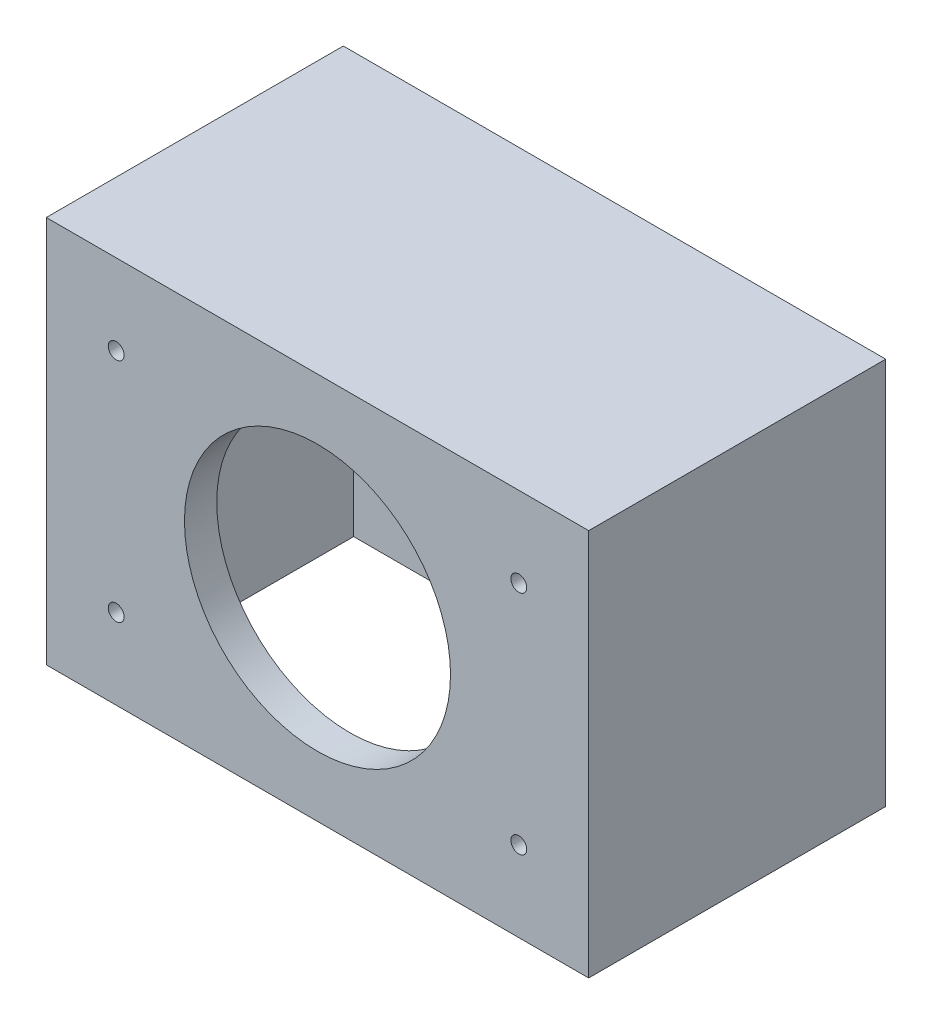
ISO-10303-21;
HEADER;
FILE_DESCRIPTION(('STEP AP214'),'2;1');
FILE_NAME('part.step','',(''),(''),'','','');
FILE_SCHEMA(('AUTOMOTIVE_DESIGN { 1 0 10303 214 1 1 1 1 }'));
ENDSEC;
DATA;
#1=APPLICATION_CONTEXT('core data for automotive mechanical design processes');
#2=APPLICATION_PROTOCOL_DEFINITION('international standard','automotive_design',2000,#1);
#3=PRODUCT_CONTEXT('',#1,'mechanical');
#4=PRODUCT('Part','Part','',(#3));
#5=PRODUCT_RELATED_PRODUCT_CATEGORY('part','',(#4));
#6=PRODUCT_DEFINITION_FORMATION('','',#4);
#7=PRODUCT_DEFINITION_CONTEXT('part definition',#1,'design');
#8=PRODUCT_DEFINITION('design','',#6,#7);
#9=PRODUCT_DEFINITION_SHAPE('','',#8);
#10=(LENGTH_UNIT() NAMED_UNIT(*) SI_UNIT(.MILLI.,.METRE.));
#11=(NAMED_UNIT(*) PLANE_ANGLE_UNIT() SI_UNIT($,.RADIAN.));
#12=(NAMED_UNIT(*) SI_UNIT($,.STERADIAN.) SOLID_ANGLE_UNIT());
#13=UNCERTAINTY_MEASURE_WITH_UNIT(LENGTH_MEASURE(1.E-05),#10,'distance_accuracy_value','');
#14=(GEOMETRIC_REPRESENTATION_CONTEXT(3) GLOBAL_UNCERTAINTY_ASSIGNED_CONTEXT((#13)) GLOBAL_UNIT_ASSIGNED_CONTEXT((#10,
#11,#12)) REPRESENTATION_CONTEXT('',''));
#15=CARTESIAN_POINT('',(0.,0.,0.));
#16=DIRECTION('',(0.,0.,1.));
#17=DIRECTION('',(1.,0.,0.));
#18=AXIS2_PLACEMENT_3D('',#15,#16,#17);
#19=CARTESIAN_POINT('',(105.,-75.,115.));
#20=DIRECTION('',(-1.,0.,0.));
#21=DIRECTION('',(0.,0.,1.));
#22=AXIS2_PLACEMENT_3D('',#19,#20,#21);
#23=PLANE('',#22);
#24=DIRECTION('',(0.,1.,0.));
#25=VECTOR('',#24,1.);
#26=CARTESIAN_POINT('',(105.,-75.,0.));
#27=LINE('',#26,#25);
#28=CARTESIAN_POINT('',(105.,-75.,0.));
#29=VERTEX_POINT('',#28);
#30=CARTESIAN_POINT('',(105.,75.,0.));
#31=VERTEX_POINT('',#30);
#32=EDGE_CURVE('E160',#29,#31,#27,.T.);
#33=ORIENTED_EDGE('',*,*,#32,.T.);
#34=DIRECTION('',(0.,0.,-1.));
#35=VECTOR('',#34,1.);
#36=CARTESIAN_POINT('',(105.,75.,115.));
#37=LINE('',#36,#35);
#38=CARTESIAN_POINT('',(105.,75.,115.));
#39=VERTEX_POINT('',#38);
#40=EDGE_CURVE('E11',#39,#31,#37,.T.);
#41=ORIENTED_EDGE('',*,*,#40,.F.);
#42=DIRECTION('',(0.,1.,0.));
#43=VECTOR('',#42,1.);
#44=CARTESIAN_POINT('',(105.,-75.,115.));
#45=LINE('',#44,#43);
#46=CARTESIAN_POINT('',(105.,-75.,115.));
#47=VERTEX_POINT('',#46);
#48=EDGE_CURVE('E166',#47,#39,#45,.T.);
#49=ORIENTED_EDGE('',*,*,#48,.F.);
#50=DIRECTION('',(0.,0.,-1.));
#51=VECTOR('',#50,1.);
#52=CARTESIAN_POINT('',(105.,-75.,115.));
#53=LINE('',#52,#51);
#54=EDGE_CURVE('E63',#47,#29,#53,.T.);
#55=ORIENTED_EDGE('',*,*,#54,.T.);
#56=EDGE_LOOP('',(#33,#41,#49,#55));
#57=FACE_BOUND('',#56,.T.);
#58=ADVANCED_FACE('F39',(#57),#23,.F.);
#59=CARTESIAN_POINT('',(105.,75.,115.));
#60=DIRECTION('',(0.,-1.,0.));
#61=DIRECTION('',(1.,0.,0.));
#62=AXIS2_PLACEMENT_3D('',#59,#60,#61);
#63=PLANE('',#62);
#64=DIRECTION('',(-1.,0.,0.));
#65=VECTOR('',#64,1.);
#66=CARTESIAN_POINT('',(105.,75.,0.));
#67=LINE('',#66,#65);
#68=CARTESIAN_POINT('',(-105.,75.,0.));
#69=VERTEX_POINT('',#68);
#70=EDGE_CURVE('E181',#31,#69,#67,.T.);
#71=ORIENTED_EDGE('',*,*,#70,.T.);
#72=DIRECTION('',(0.,0.,-1.));
#73=VECTOR('',#72,1.);
#74=CARTESIAN_POINT('',(-105.,75.,115.));
#75=LINE('',#74,#73);
#76=CARTESIAN_POINT('',(-105.,75.,115.));
#77=VERTEX_POINT('',#76);
#78=EDGE_CURVE('E47',#77,#69,#75,.T.);
#79=ORIENTED_EDGE('',*,*,#78,.F.);
#80=DIRECTION('',(-1.,0.,0.));
#81=VECTOR('',#80,1.);
#82=CARTESIAN_POINT('',(105.,75.,115.));
#83=LINE('',#82,#81);
#84=EDGE_CURVE('E89',#39,#77,#83,.T.);
#85=ORIENTED_EDGE('',*,*,#84,.F.);
#86=ORIENTED_EDGE('',*,*,#40,.T.);
#87=EDGE_LOOP('',(#71,#79,#85,#86));
#88=FACE_BOUND('',#87,.T.);
#89=ADVANCED_FACE('F201',(#88),#63,.F.);
#90=CARTESIAN_POINT('',(-105.,-75.,115.));
#91=DIRECTION('',(-1.,0.,0.));
#92=DIRECTION('',(0.,0.,1.));
#93=AXIS2_PLACEMENT_3D('',#90,#91,#92);
#94=PLANE('',#93);
#95=DIRECTION('',(0.,1.,0.));
#96=VECTOR('',#95,1.);
#97=CARTESIAN_POINT('',(-105.,-75.,0.));
#98=LINE('',#97,#96);
#99=CARTESIAN_POINT('',(-105.,-75.,0.));
#100=VERTEX_POINT('',#99);
#101=EDGE_CURVE('E185',#100,#69,#98,.T.);
#102=ORIENTED_EDGE('',*,*,#101,.F.);
#103=DIRECTION('',(0.,0.,-1.));
#104=VECTOR('',#103,1.);
#105=CARTESIAN_POINT('',(-105.,-75.,115.));
#106=LINE('',#105,#104);
#107=CARTESIAN_POINT('',(-105.,-75.,115.));
#108=VERTEX_POINT('',#107);
#109=EDGE_CURVE('E194',#108,#100,#106,.T.);
#110=ORIENTED_EDGE('',*,*,#109,.F.);
#111=DIRECTION('',(0.,1.,0.));
#112=VECTOR('',#111,1.);
#113=CARTESIAN_POINT('',(-105.,-75.,115.));
#114=LINE('',#113,#112);
#115=EDGE_CURVE('E172',#108,#77,#114,.T.);
#116=ORIENTED_EDGE('',*,*,#115,.T.);
#117=ORIENTED_EDGE('',*,*,#78,.T.);
#118=EDGE_LOOP('',(#102,#110,#116,#117));
#119=FACE_BOUND('',#118,.T.);
#120=ADVANCED_FACE('F199',(#119),#94,.T.);
#121=CARTESIAN_POINT('',(105.,-75.,115.));
#122=DIRECTION('',(0.,-1.,0.));
#123=DIRECTION('',(1.,0.,0.));
#124=AXIS2_PLACEMENT_3D('',#121,#122,#123);
#125=PLANE('',#124);
#126=DIRECTION('',(0.,0.,-1.));
#127=VECTOR('',#126,1.);
#128=CARTESIAN_POINT('',(-88.4868315072394,-75.,12.5));
#129=LINE('',#128,#127);
#130=CARTESIAN_POINT('',(-88.4868315072394,-75.,102.5));
#131=VERTEX_POINT('',#130);
#132=CARTESIAN_POINT('',(-88.4868315072394,-75.,12.5));
#133=VERTEX_POINT('',#132);
#134=EDGE_CURVE('E54',#131,#133,#129,.T.);
#135=ORIENTED_EDGE('',*,*,#134,.F.);
#136=DIRECTION('',(-1.,0.,0.));
#137=VECTOR('',#136,1.);
#138=CARTESIAN_POINT('',(88.4868315072394,-75.,102.5));
#139=LINE('',#138,#137);
#140=CARTESIAN_POINT('',(88.4868315072394,-75.,102.5));
#141=VERTEX_POINT('',#140);
#142=EDGE_CURVE('E135',#141,#131,#139,.T.);
#143=ORIENTED_EDGE('',*,*,#142,.F.);
#144=DIRECTION('',(0.,0.,1.));
#145=VECTOR('',#144,1.);
#146=CARTESIAN_POINT('',(88.4868315072394,-75.,12.5));
#147=LINE('',#146,#145);
#148=CARTESIAN_POINT('',(88.4868315072394,-75.,12.5));
#149=VERTEX_POINT('',#148);
#150=EDGE_CURVE('E139',#149,#141,#147,.T.);
#151=ORIENTED_EDGE('',*,*,#150,.F.);
#152=DIRECTION('',(1.,0.,0.));
#153=VECTOR('',#152,1.);
#154=CARTESIAN_POINT('',(88.4868315072394,-75.,12.5));
#155=LINE('',#154,#153);
#156=EDGE_CURVE('E151',#133,#149,#155,.T.);
#157=ORIENTED_EDGE('',*,*,#156,.F.);
#158=EDGE_LOOP('',(#135,#143,#151,#157));
#159=FACE_BOUND('',#158,.T.);
#160=DIRECTION('',(-1.,0.,0.));
#161=VECTOR('',#160,1.);
#162=CARTESIAN_POINT('',(105.,-75.,0.));
#163=LINE('',#162,#161);
#164=EDGE_CURVE('E169',#29,#100,#163,.T.);
#165=ORIENTED_EDGE('',*,*,#164,.F.);
#166=ORIENTED_EDGE('',*,*,#54,.F.);
#167=DIRECTION('',(-1.,0.,0.));
#168=VECTOR('',#167,1.);
#169=CARTESIAN_POINT('',(105.,-75.,115.));
#170=LINE('',#169,#168);
#171=EDGE_CURVE('E176',#47,#108,#170,.T.);
#172=ORIENTED_EDGE('',*,*,#171,.T.);
#173=ORIENTED_EDGE('',*,*,#109,.T.);
#174=EDGE_LOOP('',(#165,#166,#172,#173));
#175=FACE_BOUND('',#174,.T.);
#176=ADVANCED_FACE('F205',(#159,#175),#125,.T.);
#177=CARTESIAN_POINT('',(0.,0.,115.));
#178=DIRECTION('',(0.,0.,1.));
#179=DIRECTION('',(1.,0.,0.));
#180=AXIS2_PLACEMENT_3D('',#177,#178,#179);
#181=PLANE('',#180);
#182=CARTESIAN_POINT('',(0.,0.,115.));
#183=DIRECTION('',(0.,0.,1.));
#184=DIRECTION('',(1.,0.,0.));
#185=AXIS2_PLACEMENT_3D('',#182,#183,#184);
#186=CIRCLE('',#185,51.5);
#187=CARTESIAN_POINT('',(51.5,0.,115.));
#188=VERTEX_POINT('',#187);
#189=EDGE_CURVE('E264',#188,#188,#186,.T.);
#190=ORIENTED_EDGE('',*,*,#189,.F.);
#191=EDGE_LOOP('',(#190));
#192=FACE_BOUND('',#191,.T.);
#193=CARTESIAN_POINT('',(77.9422863405997,-43.87482193696,115.));
#194=DIRECTION('',(0.,0.,1.));
#195=DIRECTION('',(-1.,0.,0.));
#196=AXIS2_PLACEMENT_3D('',#193,#194,#195);
#197=CIRCLE('',#196,3.07250000000001);
#198=CARTESIAN_POINT('',(74.8697863405997,-43.87482193696,115.));
#199=VERTEX_POINT('',#198);
#200=EDGE_CURVE('E269',#199,#199,#197,.T.);
#201=ORIENTED_EDGE('',*,*,#200,.F.);
#202=EDGE_LOOP('',(#201));
#203=FACE_BOUND('',#202,.T.);
#204=CARTESIAN_POINT('',(-77.9422863405997,-43.8748219369601,115.));
#205=DIRECTION('',(0.,0.,1.));
#206=DIRECTION('',(1.,0.,0.));
#207=AXIS2_PLACEMENT_3D('',#204,#205,#206);
#208=CIRCLE('',#207,3.07250000000001);
#209=CARTESIAN_POINT('',(-74.8697863405997,-43.8748219369601,115.));
#210=VERTEX_POINT('',#209);
#211=EDGE_CURVE('E288',#210,#210,#208,.T.);
#212=ORIENTED_EDGE('',*,*,#211,.F.);
#213=EDGE_LOOP('',(#212));
#214=FACE_BOUND('',#213,.T.);
#215=CARTESIAN_POINT('',(-77.9422863405997,43.8748219369601,115.));
#216=DIRECTION('',(0.,0.,1.));
#217=DIRECTION('',(-1.,0.,0.));
#218=AXIS2_PLACEMENT_3D('',#215,#216,#217);
#219=CIRCLE('',#218,3.07250000000001);
#220=CARTESIAN_POINT('',(-81.0147863405997,43.8748219369601,115.));
#221=VERTEX_POINT('',#220);
#222=EDGE_CURVE('E278',#221,#221,#219,.T.);
#223=ORIENTED_EDGE('',*,*,#222,.F.);
#224=EDGE_LOOP('',(#223));
#225=FACE_BOUND('',#224,.T.);
#226=CARTESIAN_POINT('',(77.9422863405997,43.8748219369601,115.));
#227=DIRECTION('',(0.,0.,1.));
#228=DIRECTION('',(1.,0.,0.));
#229=AXIS2_PLACEMENT_3D('',#226,#227,#228);
#230=CIRCLE('',#229,3.07250000000001);
#231=CARTESIAN_POINT('',(81.0147863405997,43.8748219369601,115.));
#232=VERTEX_POINT('',#231);
#233=EDGE_CURVE('E287',#232,#232,#230,.T.);
#234=ORIENTED_EDGE('',*,*,#233,.F.);
#235=EDGE_LOOP('',(#234));
#236=FACE_BOUND('',#235,.T.);
#237=ORIENTED_EDGE('',*,*,#48,.T.);
#238=ORIENTED_EDGE('',*,*,#84,.T.);
#239=ORIENTED_EDGE('',*,*,#115,.F.);
#240=ORIENTED_EDGE('',*,*,#171,.F.);
#241=EDGE_LOOP('',(#237,#238,#239,#240));
#242=FACE_BOUND('',#241,.T.);
#243=ADVANCED_FACE('F208',(#192,#203,#214,#225,#236,#242),#181,.T.);
#244=CARTESIAN_POINT('',(0.,0.,0.));
#245=DIRECTION('',(0.,0.,1.));
#246=DIRECTION('',(1.,0.,0.));
#247=AXIS2_PLACEMENT_3D('',#244,#245,#246);
#248=PLANE('',#247);
#249=ORIENTED_EDGE('',*,*,#32,.F.);
#250=ORIENTED_EDGE('',*,*,#164,.T.);
#251=ORIENTED_EDGE('',*,*,#101,.T.);
#252=ORIENTED_EDGE('',*,*,#70,.F.);
#253=EDGE_LOOP('',(#249,#250,#251,#252));
#254=FACE_BOUND('',#253,.T.);
#255=ADVANCED_FACE('F204',(#254),#248,.F.);
#256=CARTESIAN_POINT('',(-88.4868315072394,54.,12.5));
#257=DIRECTION('',(-1.,0.,0.));
#258=DIRECTION('',(0.,-1.,0.));
#259=AXIS2_PLACEMENT_3D('',#256,#257,#258);
#260=PLANE('',#259);
#261=ORIENTED_EDGE('',*,*,#134,.T.);
#262=DIRECTION('',(0.,-1.,0.));
#263=VECTOR('',#262,1.);
#264=CARTESIAN_POINT('',(-88.4868315072394,54.,12.5));
#265=LINE('',#264,#263);
#266=CARTESIAN_POINT('',(-88.4868315072394,54.,12.5));
#267=VERTEX_POINT('',#266);
#268=EDGE_CURVE('E110',#267,#133,#265,.T.);
#269=ORIENTED_EDGE('',*,*,#268,.F.);
#270=DIRECTION('',(0.,0.,-1.));
#271=VECTOR('',#270,1.);
#272=CARTESIAN_POINT('',(-88.4868315072394,54.,12.5));
#273=LINE('',#272,#271);
#274=CARTESIAN_POINT('',(-88.4868315072394,54.,102.5));
#275=VERTEX_POINT('',#274);
#276=EDGE_CURVE('E114',#275,#267,#273,.T.);
#277=ORIENTED_EDGE('',*,*,#276,.F.);
#278=DIRECTION('',(0.,-1.,0.));
#279=VECTOR('',#278,1.);
#280=CARTESIAN_POINT('',(-88.4868315072394,54.,102.5));
#281=LINE('',#280,#279);
#282=EDGE_CURVE('E157',#275,#131,#281,.T.);
#283=ORIENTED_EDGE('',*,*,#282,.T.);
#284=EDGE_LOOP('',(#261,#269,#277,#283));
#285=FACE_BOUND('',#284,.T.);
#286=ADVANCED_FACE('F112',(#285),#260,.F.);
#287=CARTESIAN_POINT('',(88.4868315072394,54.0000000000001,102.5));
#288=DIRECTION('',(0.,0.,1.));
#289=DIRECTION('',(1.,0.,0.));
#290=AXIS2_PLACEMENT_3D('',#287,#288,#289);
#291=PLANE('',#290);
#292=CARTESIAN_POINT('',(0.,0.,102.5));
#293=DIRECTION('',(0.,0.,1.));
#294=DIRECTION('',(1.,0.,0.));
#295=AXIS2_PLACEMENT_3D('',#292,#293,#294);
#296=CIRCLE('',#295,51.5);
#297=CARTESIAN_POINT('',(51.5,0.,102.5));
#298=VERTEX_POINT('',#297);
#299=EDGE_CURVE('E267',#298,#298,#296,.F.);
#300=ORIENTED_EDGE('',*,*,#299,.F.);
#301=EDGE_LOOP('',(#300));
#302=FACE_BOUND('',#301,.T.);
#303=CARTESIAN_POINT('',(77.9422863405997,-43.87482193696,102.5));
#304=DIRECTION('',(0.,0.,1.));
#305=DIRECTION('',(1.,0.,0.));
#306=AXIS2_PLACEMENT_3D('',#303,#304,#305);
#307=CIRCLE('',#306,3.07250000000001);
#308=CARTESIAN_POINT('',(81.0147863405997,-43.87482193696,102.5));
#309=VERTEX_POINT('',#308);
#310=EDGE_CURVE('E274',#309,#309,#307,.F.);
#311=ORIENTED_EDGE('',*,*,#310,.F.);
#312=EDGE_LOOP('',(#311));
#313=FACE_BOUND('',#312,.T.);
#314=CARTESIAN_POINT('',(-77.9422863405997,-43.8748219369601,102.5));
#315=DIRECTION('',(0.,0.,1.));
#316=DIRECTION('',(1.,0.,0.));
#317=AXIS2_PLACEMENT_3D('',#314,#315,#316);
#318=CIRCLE('',#317,3.07250000000001);
#319=CARTESIAN_POINT('',(-74.8697863405997,-43.8748219369601,102.5));
#320=VERTEX_POINT('',#319);
#321=EDGE_CURVE('E283',#320,#320,#318,.F.);
#322=ORIENTED_EDGE('',*,*,#321,.F.);
#323=EDGE_LOOP('',(#322));
#324=FACE_BOUND('',#323,.T.);
#325=CARTESIAN_POINT('',(-77.9422863405997,43.8748219369601,102.5));
#326=DIRECTION('',(0.,0.,1.));
#327=DIRECTION('',(1.,0.,0.));
#328=AXIS2_PLACEMENT_3D('',#325,#326,#327);
#329=CIRCLE('',#328,3.07250000000001);
#330=CARTESIAN_POINT('',(-74.8697863405997,43.8748219369601,102.5));
#331=VERTEX_POINT('',#330);
#332=EDGE_CURVE('E282',#331,#331,#329,.F.);
#333=ORIENTED_EDGE('',*,*,#332,.F.);
#334=EDGE_LOOP('',(#333));
#335=FACE_BOUND('',#334,.T.);
#336=CARTESIAN_POINT('',(77.9422863405997,43.8748219369601,102.5));
#337=DIRECTION('',(0.,0.,1.));
#338=DIRECTION('',(1.,0.,0.));
#339=AXIS2_PLACEMENT_3D('',#336,#337,#338);
#340=CIRCLE('',#339,3.07250000000001);
#341=CARTESIAN_POINT('',(81.0147863405997,43.8748219369601,102.5));
#342=VERTEX_POINT('',#341);
#343=EDGE_CURVE('E142',#342,#342,#340,.F.);
#344=ORIENTED_EDGE('',*,*,#343,.F.);
#345=EDGE_LOOP('',(#344));
#346=FACE_BOUND('',#345,.T.);
#347=ORIENTED_EDGE('',*,*,#142,.T.);
#348=ORIENTED_EDGE('',*,*,#282,.F.);
#349=DIRECTION('',(-1.,0.,0.));
#350=VECTOR('',#349,1.);
#351=CARTESIAN_POINT('',(88.4868315072394,54.0000000000001,102.5));
#352=LINE('',#351,#350);
#353=CARTESIAN_POINT('',(88.4868315072394,54.0000000000001,102.5));
#354=VERTEX_POINT('',#353);
#355=EDGE_CURVE('E121',#354,#275,#352,.T.);
#356=ORIENTED_EDGE('',*,*,#355,.F.);
#357=DIRECTION('',(0.,-1.,0.));
#358=VECTOR('',#357,1.);
#359=CARTESIAN_POINT('',(88.4868315072394,54.0000000000001,102.5));
#360=LINE('',#359,#358);
#361=EDGE_CURVE('E161',#354,#141,#360,.T.);
#362=ORIENTED_EDGE('',*,*,#361,.T.);
#363=EDGE_LOOP('',(#347,#348,#356,#362));
#364=FACE_BOUND('',#363,.T.);
#365=ADVANCED_FACE('F228',(#302,#313,#324,#335,#346,#364),#291,.F.);
#366=CARTESIAN_POINT('',(88.4868315072394,54.0000000000001,12.5));
#367=DIRECTION('',(1.,0.,0.));
#368=DIRECTION('',(0.,1.,0.));
#369=AXIS2_PLACEMENT_3D('',#366,#367,#368);
#370=PLANE('',#369);
#371=ORIENTED_EDGE('',*,*,#150,.T.);
#372=ORIENTED_EDGE('',*,*,#361,.F.);
#373=DIRECTION('',(0.,0.,1.));
#374=VECTOR('',#373,1.);
#375=CARTESIAN_POINT('',(88.4868315072394,54.0000000000001,12.5));
#376=LINE('',#375,#374);
#377=CARTESIAN_POINT('',(88.4868315072394,54.0000000000001,12.5));
#378=VERTEX_POINT('',#377);
#379=EDGE_CURVE('E130',#378,#354,#376,.T.);
#380=ORIENTED_EDGE('',*,*,#379,.F.);
#381=DIRECTION('',(0.,-1.,0.));
#382=VECTOR('',#381,1.);
#383=CARTESIAN_POINT('',(88.4868315072394,54.0000000000001,12.5));
#384=LINE('',#383,#382);
#385=EDGE_CURVE('E120',#378,#149,#384,.T.);
#386=ORIENTED_EDGE('',*,*,#385,.T.);
#387=EDGE_LOOP('',(#371,#372,#380,#386));
#388=FACE_BOUND('',#387,.T.);
#389=ADVANCED_FACE('F231',(#388),#370,.F.);
#390=CARTESIAN_POINT('',(88.4868315072394,54.0000000000001,12.5));
#391=DIRECTION('',(0.,0.,-1.));
#392=DIRECTION('',(-1.,0.,0.));
#393=AXIS2_PLACEMENT_3D('',#390,#391,#392);
#394=PLANE('',#393);
#395=ORIENTED_EDGE('',*,*,#156,.T.);
#396=ORIENTED_EDGE('',*,*,#385,.F.);
#397=DIRECTION('',(1.,0.,0.));
#398=VECTOR('',#397,1.);
#399=CARTESIAN_POINT('',(88.4868315072394,54.0000000000001,12.5));
#400=LINE('',#399,#398);
#401=EDGE_CURVE('E124',#267,#378,#400,.T.);
#402=ORIENTED_EDGE('',*,*,#401,.F.);
#403=ORIENTED_EDGE('',*,*,#268,.T.);
#404=EDGE_LOOP('',(#395,#396,#402,#403));
#405=FACE_BOUND('',#404,.T.);
#406=ADVANCED_FACE('F125',(#405),#394,.F.);
#407=CARTESIAN_POINT('',(0.,54.,0.));
#408=DIRECTION('',(0.,-1.,0.));
#409=DIRECTION('',(1.,0.,0.));
#410=AXIS2_PLACEMENT_3D('',#407,#408,#409);
#411=PLANE('',#410);
#412=ORIENTED_EDGE('',*,*,#276,.T.);
#413=ORIENTED_EDGE('',*,*,#401,.T.);
#414=ORIENTED_EDGE('',*,*,#379,.T.);
#415=ORIENTED_EDGE('',*,*,#355,.T.);
#416=EDGE_LOOP('',(#412,#413,#414,#415));
#417=FACE_BOUND('',#416,.T.);
#418=ADVANCED_FACE('F132',(#417),#411,.T.);
#419=CARTESIAN_POINT('',(77.9422863405997,43.8748219369601,-0.001000000000001));
#420=DIRECTION('',(0.,0.,1.));
#421=DIRECTION('',(1.,0.,0.));
#422=AXIS2_PLACEMENT_3D('',#419,#420,#421);
#423=CYLINDRICAL_SURFACE('',#422,3.07250000000001);
#424=ORIENTED_EDGE('',*,*,#233,.T.);
#425=EDGE_LOOP('',(#424));
#426=FACE_BOUND('',#425,.T.);
#427=ORIENTED_EDGE('',*,*,#343,.T.);
#428=EDGE_LOOP('',(#427));
#429=FACE_BOUND('',#428,.T.);
#430=ADVANCED_FACE('F240',(#426,#429),#423,.F.);
#431=CARTESIAN_POINT('',(-77.9422863405997,43.8748219369601,-0.001000000000001));
#432=DIRECTION('',(0.,0.,1.));
#433=DIRECTION('',(1.,0.,0.));
#434=AXIS2_PLACEMENT_3D('',#431,#432,#433);
#435=CYLINDRICAL_SURFACE('',#434,3.07250000000001);
#436=ORIENTED_EDGE('',*,*,#222,.T.);
#437=EDGE_LOOP('',(#436));
#438=FACE_BOUND('',#437,.T.);
#439=ORIENTED_EDGE('',*,*,#332,.T.);
#440=EDGE_LOOP('',(#439));
#441=FACE_BOUND('',#440,.T.);
#442=ADVANCED_FACE('F243',(#438,#441),#435,.F.);
#443=CARTESIAN_POINT('',(-77.9422863405997,-43.8748219369601,-0.001000000000001));
#444=DIRECTION('',(0.,0.,1.));
#445=DIRECTION('',(1.,0.,0.));
#446=AXIS2_PLACEMENT_3D('',#443,#444,#445);
#447=CYLINDRICAL_SURFACE('',#446,3.07250000000001);
#448=ORIENTED_EDGE('',*,*,#211,.T.);
#449=EDGE_LOOP('',(#448));
#450=FACE_BOUND('',#449,.T.);
#451=ORIENTED_EDGE('',*,*,#321,.T.);
#452=EDGE_LOOP('',(#451));
#453=FACE_BOUND('',#452,.T.);
#454=ADVANCED_FACE('F249',(#450,#453),#447,.F.);
#455=CARTESIAN_POINT('',(77.9422863405997,-43.87482193696,-0.001000000000001));
#456=DIRECTION('',(0.,0.,1.));
#457=DIRECTION('',(1.,0.,0.));
#458=AXIS2_PLACEMENT_3D('',#455,#456,#457);
#459=CYLINDRICAL_SURFACE('',#458,3.07250000000001);
#460=ORIENTED_EDGE('',*,*,#200,.T.);
#461=EDGE_LOOP('',(#460));
#462=FACE_BOUND('',#461,.T.);
#463=ORIENTED_EDGE('',*,*,#310,.T.);
#464=EDGE_LOOP('',(#463));
#465=FACE_BOUND('',#464,.T.);
#466=ADVANCED_FACE('F245',(#462,#465),#459,.F.);
#467=CARTESIAN_POINT('',(0.,0.,-0.001000000000001));
#468=DIRECTION('',(0.,0.,1.));
#469=DIRECTION('',(1.,0.,0.));
#470=AXIS2_PLACEMENT_3D('',#467,#468,#469);
#471=CYLINDRICAL_SURFACE('',#470,51.5);
#472=ORIENTED_EDGE('',*,*,#189,.T.);
#473=EDGE_LOOP('',(#472));
#474=FACE_BOUND('',#473,.T.);
#475=ORIENTED_EDGE('',*,*,#299,.T.);
#476=EDGE_LOOP('',(#475));
#477=FACE_BOUND('',#476,.T.);
#478=ADVANCED_FACE('F248',(#474,#477),#471,.F.);
#479=CLOSED_SHELL('',(#58,#89,#120,#176,#243,#255,#286,#365,#389,#406,#418,#430,#442,#454,#466,#478));
#480=MANIFOLD_SOLID_BREP('B2',#479);
#481=ADVANCED_BREP_SHAPE_REPRESENTATION('',(#18,#480),#14);
#482=SHAPE_DEFINITION_REPRESENTATION(#9,#481);
ENDSEC;
END-ISO-10303-21;
